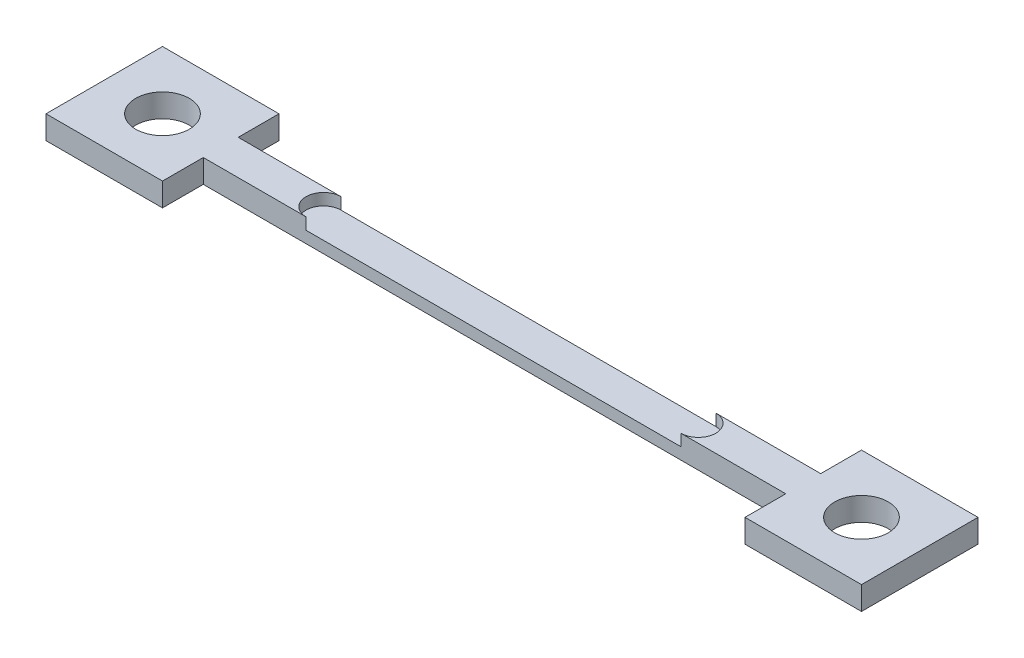
ISO-10303-21;
HEADER;
FILE_DESCRIPTION(('STEP AP214'),'2;1');
FILE_NAME('part.step','',(''),(''),'','','');
FILE_SCHEMA(('AUTOMOTIVE_DESIGN { 1 0 10303 214 1 1 1 1 }'));
ENDSEC;
DATA;
#1=APPLICATION_CONTEXT('core data for automotive mechanical design processes');
#2=APPLICATION_PROTOCOL_DEFINITION('international standard','automotive_design',2000,#1);
#3=PRODUCT_CONTEXT('',#1,'mechanical');
#4=PRODUCT('Part','Part','',(#3));
#5=PRODUCT_RELATED_PRODUCT_CATEGORY('part','',(#4));
#6=PRODUCT_DEFINITION_FORMATION('','',#4);
#7=PRODUCT_DEFINITION_CONTEXT('part definition',#1,'design');
#8=PRODUCT_DEFINITION('design','',#6,#7);
#9=PRODUCT_DEFINITION_SHAPE('','',#8);
#10=(LENGTH_UNIT() NAMED_UNIT(*) SI_UNIT(.MILLI.,.METRE.));
#11=(NAMED_UNIT(*) PLANE_ANGLE_UNIT() SI_UNIT($,.RADIAN.));
#12=(NAMED_UNIT(*) SI_UNIT($,.STERADIAN.) SOLID_ANGLE_UNIT());
#13=UNCERTAINTY_MEASURE_WITH_UNIT(LENGTH_MEASURE(1.E-05),#10,'distance_accuracy_value','');
#14=(GEOMETRIC_REPRESENTATION_CONTEXT(3) GLOBAL_UNCERTAINTY_ASSIGNED_CONTEXT((#13)) GLOBAL_UNIT_ASSIGNED_CONTEXT((#10,
#11,#12)) REPRESENTATION_CONTEXT('',''));
#15=CARTESIAN_POINT('',(0.,0.,0.));
#16=DIRECTION('',(0.,0.,1.));
#17=DIRECTION('',(1.,0.,0.));
#18=AXIS2_PLACEMENT_3D('',#15,#16,#17);
#19=CARTESIAN_POINT('',(-41.4240464845624,0.635,8.37825946530759));
#20=DIRECTION('',(0.,0.,1.));
#21=DIRECTION('',(1.,0.,0.));
#22=AXIS2_PLACEMENT_3D('',#19,#20,#21);
#23=PLANE('',#22);
#24=DIRECTION('',(0.,1.,0.));
#25=VECTOR('',#24,1.);
#26=CARTESIAN_POINT('',(-35.8219204168382,0.,8.37825946530759));
#27=LINE('',#26,#25);
#28=CARTESIAN_POINT('',(-35.8219204168382,0.,8.37825946530759));
#29=VERTEX_POINT('',#28);
#30=CARTESIAN_POINT('',(-35.8219204168382,0.635,8.37825946530759));
#31=VERTEX_POINT('',#30);
#32=EDGE_CURVE('E192',#29,#31,#27,.T.);
#33=ORIENTED_EDGE('',*,*,#32,.F.);
#34=DIRECTION('',(-1.,0.,0.));
#35=VECTOR('',#34,1.);
#36=CARTESIAN_POINT('',(0.,0.,8.37825946530759));
#37=LINE('',#36,#35);
#38=CARTESIAN_POINT('',(-15.3916667899654,0.,8.37825946530759));
#39=VERTEX_POINT('',#38);
#40=EDGE_CURVE('E252',#39,#29,#37,.T.);
#41=ORIENTED_EDGE('',*,*,#40,.F.);
#42=DIRECTION('',(0.,1.,0.));
#43=VECTOR('',#42,1.);
#44=CARTESIAN_POINT('',(-15.3916667899654,0.,8.37825946530759));
#45=LINE('',#44,#43);
#46=CARTESIAN_POINT('',(-15.3916667899654,0.635,8.37825946530759));
#47=VERTEX_POINT('',#46);
#48=EDGE_CURVE('E265',#39,#47,#45,.T.);
#49=ORIENTED_EDGE('',*,*,#48,.T.);
#50=DIRECTION('',(-1.,0.,0.));
#51=VECTOR('',#50,1.);
#52=CARTESIAN_POINT('',(-41.4240464845624,0.635,8.37825946530759));
#53=LINE('',#52,#51);
#54=CARTESIAN_POINT('',(-9.67404648456241,0.635,8.37825946530759));
#55=VERTEX_POINT('',#54);
#56=EDGE_CURVE('E373',#55,#47,#53,.T.);
#57=ORIENTED_EDGE('',*,*,#56,.F.);
#58=DIRECTION('',(0.,-1.,0.));
#59=VECTOR('',#58,1.);
#60=CARTESIAN_POINT('',(-9.67404648456241,0.635,8.37825946530759));
#61=LINE('',#60,#59);
#62=CARTESIAN_POINT('',(-9.67404648456241,-0.635,8.37825946530759));
#63=VERTEX_POINT('',#62);
#64=EDGE_CURVE('E48',#55,#63,#61,.T.);
#65=ORIENTED_EDGE('',*,*,#64,.T.);
#66=DIRECTION('',(-1.,0.,0.));
#67=VECTOR('',#66,1.);
#68=CARTESIAN_POINT('',(-41.4240464845624,-0.635,8.37825946530759));
#69=LINE('',#68,#67);
#70=CARTESIAN_POINT('',(-41.4240464845624,-0.635,8.37825946530759));
#71=VERTEX_POINT('',#70);
#72=EDGE_CURVE('E352',#63,#71,#69,.T.);
#73=ORIENTED_EDGE('',*,*,#72,.T.);
#74=DIRECTION('',(0.,-1.,0.));
#75=VECTOR('',#74,1.);
#76=CARTESIAN_POINT('',(-41.4240464845624,0.635,8.37825946530759));
#77=LINE('',#76,#75);
#78=CARTESIAN_POINT('',(-41.4240464845624,0.635,8.37825946530759));
#79=VERTEX_POINT('',#78);
#80=EDGE_CURVE('E361',#79,#71,#77,.T.);
#81=ORIENTED_EDGE('',*,*,#80,.F.);
#82=EDGE_CURVE('E415',#31,#79,#53,.T.);
#83=ORIENTED_EDGE('',*,*,#82,.F.);
#84=EDGE_LOOP('',(#33,#41,#49,#57,#65,#73,#81,#83));
#85=FACE_BOUND('',#84,.T.);
#86=ADVANCED_FACE('F39',(#85),#23,.F.);
#87=CARTESIAN_POINT('',(-3.32404648456241,0.635,6.15575946530759));
#88=DIRECTION('',(0.,1.,0.));
#89=DIRECTION('',(0.,0.,1.));
#90=AXIS2_PLACEMENT_3D('',#87,#88,#89);
#91=PLANE('',#90);
#92=CARTESIAN_POINT('',(-35.8219204168382,0.635,9.33075946530759));
#93=DIRECTION('',(0.,1.,0.));
#94=DIRECTION('',(0.,0.,1.));
#95=AXIS2_PLACEMENT_3D('',#92,#93,#94);
#96=CIRCLE('',#95,0.952500000000003);
#97=CARTESIAN_POINT('',(-35.8219204168382,0.635,10.2832594653076));
#98=VERTEX_POINT('',#97);
#99=EDGE_CURVE('E255',#31,#98,#96,.T.);
#100=ORIENTED_EDGE('',*,*,#99,.F.);
#101=ORIENTED_EDGE('',*,*,#82,.T.);
#102=DIRECTION('',(0.,0.,-1.));
#103=VECTOR('',#102,1.);
#104=CARTESIAN_POINT('',(-41.4240464845624,0.635,8.37825946530759));
#105=LINE('',#104,#103);
#106=CARTESIAN_POINT('',(-41.4240464845624,0.635,6.15575946530758));
#107=VERTEX_POINT('',#106);
#108=EDGE_CURVE('E412',#79,#107,#105,.T.);
#109=ORIENTED_EDGE('',*,*,#108,.T.);
#110=DIRECTION('',(-1.,0.,0.));
#111=VECTOR('',#110,1.);
#112=CARTESIAN_POINT('',(-47.7740464845624,0.635,6.15575946530758));
#113=LINE('',#112,#111);
#114=CARTESIAN_POINT('',(-47.7740464845624,0.635,6.15575946530758));
#115=VERTEX_POINT('',#114);
#116=EDGE_CURVE('E403',#107,#115,#113,.T.);
#117=ORIENTED_EDGE('',*,*,#116,.T.);
#118=DIRECTION('',(0.,0.,1.));
#119=VECTOR('',#118,1.);
#120=CARTESIAN_POINT('',(-47.7740464845624,0.635,12.5057594653076));
#121=LINE('',#120,#119);
#122=CARTESIAN_POINT('',(-47.7740464845624,0.635,12.5057594653076));
#123=VERTEX_POINT('',#122);
#124=EDGE_CURVE('E392',#115,#123,#121,.T.);
#125=ORIENTED_EDGE('',*,*,#124,.T.);
#126=DIRECTION('',(1.,0.,0.));
#127=VECTOR('',#126,1.);
#128=CARTESIAN_POINT('',(-47.7740464845624,0.635,12.5057594653076));
#129=LINE('',#128,#127);
#130=CARTESIAN_POINT('',(-41.4240464845624,0.635,12.5057594653076));
#131=VERTEX_POINT('',#130);
#132=EDGE_CURVE('E402',#123,#131,#129,.T.);
#133=ORIENTED_EDGE('',*,*,#132,.T.);
#134=DIRECTION('',(0.,0.,-1.));
#135=VECTOR('',#134,1.);
#136=CARTESIAN_POINT('',(-41.4240464845624,0.635,10.2832594653076));
#137=LINE('',#136,#135);
#138=CARTESIAN_POINT('',(-41.4240464845624,0.635,10.2832594653076));
#139=VERTEX_POINT('',#138);
#140=EDGE_CURVE('E334',#131,#139,#137,.T.);
#141=ORIENTED_EDGE('',*,*,#140,.T.);
#142=DIRECTION('',(1.,0.,0.));
#143=VECTOR('',#142,1.);
#144=CARTESIAN_POINT('',(-41.4240464845624,0.635,10.2832594653076));
#145=LINE('',#144,#143);
#146=EDGE_CURVE('E157',#139,#98,#145,.T.);
#147=ORIENTED_EDGE('',*,*,#146,.T.);
#148=EDGE_LOOP('',(#100,#101,#109,#117,#125,#133,#141,#147));
#149=FACE_BOUND('',#148,.T.);
#150=CARTESIAN_POINT('',(-44.5990464845624,0.635,9.33075946530758));
#151=DIRECTION('',(0.,1.,0.));
#152=DIRECTION('',(0.,0.,1.));
#153=AXIS2_PLACEMENT_3D('',#150,#151,#152);
#154=CIRCLE('',#153,1.4605);
#155=CARTESIAN_POINT('',(-44.5990464845624,0.635,10.7912594653076));
#156=VERTEX_POINT('',#155);
#157=EDGE_CURVE('E199',#156,#156,#154,.T.);
#158=ORIENTED_EDGE('',*,*,#157,.F.);
#159=EDGE_LOOP('',(#158));
#160=FACE_BOUND('',#159,.T.);
#161=ADVANCED_FACE('F331',(#149,#160),#91,.T.);
#162=CARTESIAN_POINT('',(-9.67404648456241,0.635,6.15575946530759));
#163=DIRECTION('',(0.,0.,1.));
#164=DIRECTION('',(1.,0.,0.));
#165=AXIS2_PLACEMENT_3D('',#162,#163,#164);
#166=PLANE('',#165);
#167=DIRECTION('',(-1.,0.,0.));
#168=VECTOR('',#167,1.);
#169=CARTESIAN_POINT('',(-9.67404648456241,-0.635,6.15575946530759));
#170=LINE('',#169,#168);
#171=CARTESIAN_POINT('',(-3.32404648456241,-0.635,6.15575946530759));
#172=VERTEX_POINT('',#171);
#173=CARTESIAN_POINT('',(-9.67404648456241,-0.635,6.15575946530759));
#174=VERTEX_POINT('',#173);
#175=EDGE_CURVE('E214',#172,#174,#170,.T.);
#176=ORIENTED_EDGE('',*,*,#175,.T.);
#177=DIRECTION('',(0.,-1.,0.));
#178=VECTOR('',#177,1.);
#179=CARTESIAN_POINT('',(-9.67404648456241,0.635,6.15575946530759));
#180=LINE('',#179,#178);
#181=CARTESIAN_POINT('',(-9.67404648456241,0.635,6.15575946530759));
#182=VERTEX_POINT('',#181);
#183=EDGE_CURVE('E12',#182,#174,#180,.T.);
#184=ORIENTED_EDGE('',*,*,#183,.F.);
#185=DIRECTION('',(-1.,0.,0.));
#186=VECTOR('',#185,1.);
#187=CARTESIAN_POINT('',(-9.67404648456241,0.635,6.15575946530759));
#188=LINE('',#187,#186);
#189=CARTESIAN_POINT('',(-3.32404648456241,0.635,6.15575946530759));
#190=VERTEX_POINT('',#189);
#191=EDGE_CURVE('E215',#190,#182,#188,.T.);
#192=ORIENTED_EDGE('',*,*,#191,.F.);
#193=DIRECTION('',(0.,-1.,0.));
#194=VECTOR('',#193,1.);
#195=CARTESIAN_POINT('',(-3.32404648456241,0.635,6.15575946530759));
#196=LINE('',#195,#194);
#197=EDGE_CURVE('E171',#190,#172,#196,.T.);
#198=ORIENTED_EDGE('',*,*,#197,.T.);
#199=EDGE_LOOP('',(#176,#184,#192,#198));
#200=FACE_BOUND('',#199,.T.);
#201=ADVANCED_FACE('F41',(#200),#166,.F.);
#202=CARTESIAN_POINT('',(-9.67404648456241,0.635,8.37825946530759));
#203=DIRECTION('',(1.,0.,0.));
#204=DIRECTION('',(0.,0.,-1.));
#205=AXIS2_PLACEMENT_3D('',#202,#203,#204);
#206=PLANE('',#205);
#207=DIRECTION('',(0.,0.,1.));
#208=VECTOR('',#207,1.);
#209=CARTESIAN_POINT('',(-9.67404648456241,-0.635,8.37825946530759));
#210=LINE('',#209,#208);
#211=EDGE_CURVE('E349',#174,#63,#210,.T.);
#212=ORIENTED_EDGE('',*,*,#211,.T.);
#213=ORIENTED_EDGE('',*,*,#64,.F.);
#214=DIRECTION('',(0.,0.,1.));
#215=VECTOR('',#214,1.);
#216=CARTESIAN_POINT('',(-9.67404648456241,0.635,8.37825946530759));
#217=LINE('',#216,#215);
#218=EDGE_CURVE('E117',#182,#55,#217,.T.);
#219=ORIENTED_EDGE('',*,*,#218,.F.);
#220=ORIENTED_EDGE('',*,*,#183,.T.);
#221=EDGE_LOOP('',(#212,#213,#219,#220));
#222=FACE_BOUND('',#221,.T.);
#223=ADVANCED_FACE('F421',(#222),#206,.F.);
#224=CARTESIAN_POINT('',(-41.4240464845624,0.635,8.37825946530759));
#225=DIRECTION('',(-1.,0.,0.));
#226=DIRECTION('',(0.,0.,1.));
#227=AXIS2_PLACEMENT_3D('',#224,#225,#226);
#228=PLANE('',#227);
#229=DIRECTION('',(0.,0.,-1.));
#230=VECTOR('',#229,1.);
#231=CARTESIAN_POINT('',(-41.4240464845624,-0.635,8.37825946530759));
#232=LINE('',#231,#230);
#233=CARTESIAN_POINT('',(-41.4240464845624,-0.635,6.15575946530758));
#234=VERTEX_POINT('',#233);
#235=EDGE_CURVE('E355',#71,#234,#232,.T.);
#236=ORIENTED_EDGE('',*,*,#235,.T.);
#237=DIRECTION('',(0.,-1.,0.));
#238=VECTOR('',#237,1.);
#239=CARTESIAN_POINT('',(-41.4240464845624,0.635,6.15575946530758));
#240=LINE('',#239,#238);
#241=EDGE_CURVE('E364',#107,#234,#240,.T.);
#242=ORIENTED_EDGE('',*,*,#241,.F.);
#243=ORIENTED_EDGE('',*,*,#108,.F.);
#244=ORIENTED_EDGE('',*,*,#80,.T.);
#245=EDGE_LOOP('',(#236,#242,#243,#244));
#246=FACE_BOUND('',#245,.T.);
#247=ADVANCED_FACE('F423',(#246),#228,.F.);
#248=CARTESIAN_POINT('',(-47.7740464845624,0.635,6.15575946530758));
#249=DIRECTION('',(0.,0.,1.));
#250=DIRECTION('',(1.,0.,0.));
#251=AXIS2_PLACEMENT_3D('',#248,#249,#250);
#252=PLANE('',#251);
#253=DIRECTION('',(-1.,0.,0.));
#254=VECTOR('',#253,1.);
#255=CARTESIAN_POINT('',(-47.7740464845624,-0.635,6.15575946530758));
#256=LINE('',#255,#254);
#257=CARTESIAN_POINT('',(-47.7740464845624,-0.635,6.15575946530758));
#258=VERTEX_POINT('',#257);
#259=EDGE_CURVE('E297',#234,#258,#256,.T.);
#260=ORIENTED_EDGE('',*,*,#259,.T.);
#261=DIRECTION('',(0.,-1.,0.));
#262=VECTOR('',#261,1.);
#263=CARTESIAN_POINT('',(-47.7740464845624,0.635,6.15575946530758));
#264=LINE('',#263,#262);
#265=EDGE_CURVE('E283',#115,#258,#264,.T.);
#266=ORIENTED_EDGE('',*,*,#265,.F.);
#267=ORIENTED_EDGE('',*,*,#116,.F.);
#268=ORIENTED_EDGE('',*,*,#241,.T.);
#269=EDGE_LOOP('',(#260,#266,#267,#268));
#270=FACE_BOUND('',#269,.T.);
#271=ADVANCED_FACE('F386',(#270),#252,.F.);
#272=CARTESIAN_POINT('',(-47.7740464845624,0.635,12.5057594653076));
#273=DIRECTION('',(1.,0.,0.));
#274=DIRECTION('',(0.,0.,-1.));
#275=AXIS2_PLACEMENT_3D('',#272,#273,#274);
#276=PLANE('',#275);
#277=DIRECTION('',(0.,0.,1.));
#278=VECTOR('',#277,1.);
#279=CARTESIAN_POINT('',(-47.7740464845624,-0.635,12.5057594653076));
#280=LINE('',#279,#278);
#281=CARTESIAN_POINT('',(-47.7740464845624,-0.635,12.5057594653076));
#282=VERTEX_POINT('',#281);
#283=EDGE_CURVE('E292',#258,#282,#280,.T.);
#284=ORIENTED_EDGE('',*,*,#283,.T.);
#285=DIRECTION('',(0.,-1.,0.));
#286=VECTOR('',#285,1.);
#287=CARTESIAN_POINT('',(-47.7740464845624,0.635,12.5057594653076));
#288=LINE('',#287,#286);
#289=EDGE_CURVE('E279',#123,#282,#288,.T.);
#290=ORIENTED_EDGE('',*,*,#289,.F.);
#291=ORIENTED_EDGE('',*,*,#124,.F.);
#292=ORIENTED_EDGE('',*,*,#265,.T.);
#293=EDGE_LOOP('',(#284,#290,#291,#292));
#294=FACE_BOUND('',#293,.T.);
#295=ADVANCED_FACE('F390',(#294),#276,.F.);
#296=CARTESIAN_POINT('',(-47.7740464845624,0.635,12.5057594653076));
#297=DIRECTION('',(0.,0.,-1.));
#298=DIRECTION('',(-1.,0.,0.));
#299=AXIS2_PLACEMENT_3D('',#296,#297,#298);
#300=PLANE('',#299);
#301=DIRECTION('',(1.,0.,0.));
#302=VECTOR('',#301,1.);
#303=CARTESIAN_POINT('',(-47.7740464845624,-0.635,12.5057594653076));
#304=LINE('',#303,#302);
#305=CARTESIAN_POINT('',(-41.4240464845624,-0.635,12.5057594653076));
#306=VERTEX_POINT('',#305);
#307=EDGE_CURVE('E296',#282,#306,#304,.T.);
#308=ORIENTED_EDGE('',*,*,#307,.T.);
#309=DIRECTION('',(0.,-1.,0.));
#310=VECTOR('',#309,1.);
#311=CARTESIAN_POINT('',(-41.4240464845624,0.635,12.5057594653076));
#312=LINE('',#311,#310);
#313=EDGE_CURVE('E275',#131,#306,#312,.T.);
#314=ORIENTED_EDGE('',*,*,#313,.F.);
#315=ORIENTED_EDGE('',*,*,#132,.F.);
#316=ORIENTED_EDGE('',*,*,#289,.T.);
#317=EDGE_LOOP('',(#308,#314,#315,#316));
#318=FACE_BOUND('',#317,.T.);
#319=ADVANCED_FACE('F398',(#318),#300,.F.);
#320=CARTESIAN_POINT('',(-41.4240464845624,0.635,10.2832594653076));
#321=DIRECTION('',(-1.,0.,0.));
#322=DIRECTION('',(0.,0.,1.));
#323=AXIS2_PLACEMENT_3D('',#320,#321,#322);
#324=PLANE('',#323);
#325=DIRECTION('',(0.,0.,-1.));
#326=VECTOR('',#325,1.);
#327=CARTESIAN_POINT('',(-41.4240464845624,-0.635,10.2832594653076));
#328=LINE('',#327,#326);
#329=CARTESIAN_POINT('',(-41.4240464845624,-0.635,10.2832594653076));
#330=VERTEX_POINT('',#329);
#331=EDGE_CURVE('E302',#306,#330,#328,.T.);
#332=ORIENTED_EDGE('',*,*,#331,.T.);
#333=DIRECTION('',(0.,-1.,0.));
#334=VECTOR('',#333,1.);
#335=CARTESIAN_POINT('',(-41.4240464845624,0.635,10.2832594653076));
#336=LINE('',#335,#334);
#337=EDGE_CURVE('E272',#139,#330,#336,.T.);
#338=ORIENTED_EDGE('',*,*,#337,.F.);
#339=ORIENTED_EDGE('',*,*,#140,.F.);
#340=ORIENTED_EDGE('',*,*,#313,.T.);
#341=EDGE_LOOP('',(#332,#338,#339,#340));
#342=FACE_BOUND('',#341,.T.);
#343=ADVANCED_FACE('F401',(#342),#324,.F.);
#344=CARTESIAN_POINT('',(-41.4240464845624,0.635,10.2832594653076));
#345=DIRECTION('',(0.,0.,-1.));
#346=DIRECTION('',(-1.,0.,0.));
#347=AXIS2_PLACEMENT_3D('',#344,#345,#346);
#348=PLANE('',#347);
#349=DIRECTION('',(1.,0.,0.));
#350=VECTOR('',#349,1.);
#351=CARTESIAN_POINT('',(0.,0.,10.2832594653076));
#352=LINE('',#351,#350);
#353=CARTESIAN_POINT('',(-35.8219204168382,0.,10.2832594653076));
#354=VERTEX_POINT('',#353);
#355=CARTESIAN_POINT('',(-15.3916667899654,0.,10.2832594653076));
#356=VERTEX_POINT('',#355);
#357=EDGE_CURVE('E244',#354,#356,#352,.T.);
#358=ORIENTED_EDGE('',*,*,#357,.F.);
#359=DIRECTION('',(0.,1.,0.));
#360=VECTOR('',#359,1.);
#361=CARTESIAN_POINT('',(-35.8219204168382,0.,10.2832594653076));
#362=LINE('',#361,#360);
#363=EDGE_CURVE('E193',#354,#98,#362,.T.);
#364=ORIENTED_EDGE('',*,*,#363,.T.);
#365=ORIENTED_EDGE('',*,*,#146,.F.);
#366=ORIENTED_EDGE('',*,*,#337,.T.);
#367=DIRECTION('',(1.,0.,0.));
#368=VECTOR('',#367,1.);
#369=CARTESIAN_POINT('',(-41.4240464845624,-0.635,10.2832594653076));
#370=LINE('',#369,#368);
#371=CARTESIAN_POINT('',(-9.67404648456241,-0.635,10.2832594653076));
#372=VERTEX_POINT('',#371);
#373=EDGE_CURVE('E483',#330,#372,#370,.T.);
#374=ORIENTED_EDGE('',*,*,#373,.T.);
#375=DIRECTION('',(0.,-1.,0.));
#376=VECTOR('',#375,1.);
#377=CARTESIAN_POINT('',(-9.67404648456241,0.635,10.2832594653076));
#378=LINE('',#377,#376);
#379=CARTESIAN_POINT('',(-9.67404648456241,0.635,10.2832594653076));
#380=VERTEX_POINT('',#379);
#381=EDGE_CURVE('E166',#380,#372,#378,.T.);
#382=ORIENTED_EDGE('',*,*,#381,.F.);
#383=CARTESIAN_POINT('',(-15.3916667899654,0.635,10.2832594653076));
#384=VERTEX_POINT('',#383);
#385=EDGE_CURVE('E153',#384,#380,#145,.T.);
#386=ORIENTED_EDGE('',*,*,#385,.F.);
#387=DIRECTION('',(0.,1.,0.));
#388=VECTOR('',#387,1.);
#389=CARTESIAN_POINT('',(-15.3916667899654,0.,10.2832594653076));
#390=LINE('',#389,#388);
#391=EDGE_CURVE('E55',#356,#384,#390,.T.);
#392=ORIENTED_EDGE('',*,*,#391,.F.);
#393=EDGE_LOOP('',(#358,#364,#365,#366,#374,#382,#386,#392));
#394=FACE_BOUND('',#393,.T.);
#395=ADVANCED_FACE('F330',(#394),#348,.F.);
#396=CARTESIAN_POINT('',(-9.67404648456241,0.635,10.2832594653076));
#397=DIRECTION('',(1.,0.,0.));
#398=DIRECTION('',(0.,0.,-1.));
#399=AXIS2_PLACEMENT_3D('',#396,#397,#398);
#400=PLANE('',#399);
#401=DIRECTION('',(0.,0.,1.));
#402=VECTOR('',#401,1.);
#403=CARTESIAN_POINT('',(-9.67404648456241,-0.635,10.2832594653076));
#404=LINE('',#403,#402);
#405=CARTESIAN_POINT('',(-9.67404648456241,-0.635,12.5057594653076));
#406=VERTEX_POINT('',#405);
#407=EDGE_CURVE('E163',#372,#406,#404,.T.);
#408=ORIENTED_EDGE('',*,*,#407,.T.);
#409=DIRECTION('',(0.,-1.,0.));
#410=VECTOR('',#409,1.);
#411=CARTESIAN_POINT('',(-9.67404648456241,0.635,12.5057594653076));
#412=LINE('',#411,#410);
#413=CARTESIAN_POINT('',(-9.67404648456241,0.635,12.5057594653076));
#414=VERTEX_POINT('',#413);
#415=EDGE_CURVE('E160',#414,#406,#412,.T.);
#416=ORIENTED_EDGE('',*,*,#415,.F.);
#417=DIRECTION('',(0.,0.,1.));
#418=VECTOR('',#417,1.);
#419=CARTESIAN_POINT('',(-9.67404648456241,0.635,10.2832594653076));
#420=LINE('',#419,#418);
#421=EDGE_CURVE('E145',#380,#414,#420,.T.);
#422=ORIENTED_EDGE('',*,*,#421,.F.);
#423=ORIENTED_EDGE('',*,*,#381,.T.);
#424=EDGE_LOOP('',(#408,#416,#422,#423));
#425=FACE_BOUND('',#424,.T.);
#426=ADVANCED_FACE('F161',(#425),#400,.F.);
#427=CARTESIAN_POINT('',(-9.67404648456241,0.635,12.5057594653076));
#428=DIRECTION('',(0.,0.,-1.));
#429=DIRECTION('',(-1.,0.,0.));
#430=AXIS2_PLACEMENT_3D('',#427,#428,#429);
#431=PLANE('',#430);
#432=DIRECTION('',(1.,0.,0.));
#433=VECTOR('',#432,1.);
#434=CARTESIAN_POINT('',(-9.67404648456241,-0.635,12.5057594653076));
#435=LINE('',#434,#433);
#436=CARTESIAN_POINT('',(-3.32404648456241,-0.635,12.5057594653076));
#437=VERTEX_POINT('',#436);
#438=EDGE_CURVE('E484',#406,#437,#435,.T.);
#439=ORIENTED_EDGE('',*,*,#438,.T.);
#440=DIRECTION('',(0.,-1.,0.));
#441=VECTOR('',#440,1.);
#442=CARTESIAN_POINT('',(-3.32404648456241,0.635,12.5057594653076));
#443=LINE('',#442,#441);
#444=CARTESIAN_POINT('',(-3.32404648456241,0.635,12.5057594653076));
#445=VERTEX_POINT('',#444);
#446=EDGE_CURVE('E167',#445,#437,#443,.T.);
#447=ORIENTED_EDGE('',*,*,#446,.F.);
#448=DIRECTION('',(1.,0.,0.));
#449=VECTOR('',#448,1.);
#450=CARTESIAN_POINT('',(-9.67404648456241,0.635,12.5057594653076));
#451=LINE('',#450,#449);
#452=EDGE_CURVE('E150',#414,#445,#451,.T.);
#453=ORIENTED_EDGE('',*,*,#452,.F.);
#454=ORIENTED_EDGE('',*,*,#415,.T.);
#455=EDGE_LOOP('',(#439,#447,#453,#454));
#456=FACE_BOUND('',#455,.T.);
#457=ADVANCED_FACE('F169',(#456),#431,.F.);
#458=CARTESIAN_POINT('',(-3.32404648456241,0.635,12.5057594653076));
#459=DIRECTION('',(-1.,0.,0.));
#460=DIRECTION('',(0.,0.,1.));
#461=AXIS2_PLACEMENT_3D('',#458,#459,#460);
#462=PLANE('',#461);
#463=DIRECTION('',(0.,0.,-1.));
#464=VECTOR('',#463,1.);
#465=CARTESIAN_POINT('',(-3.32404648456241,-0.635,12.5057594653076));
#466=LINE('',#465,#464);
#467=EDGE_CURVE('E109',#437,#172,#466,.T.);
#468=ORIENTED_EDGE('',*,*,#467,.T.);
#469=ORIENTED_EDGE('',*,*,#197,.F.);
#470=DIRECTION('',(0.,0.,-1.));
#471=VECTOR('',#470,1.);
#472=CARTESIAN_POINT('',(-3.32404648456241,0.635,12.5057594653076));
#473=LINE('',#472,#471);
#474=EDGE_CURVE('E64',#445,#190,#473,.T.);
#475=ORIENTED_EDGE('',*,*,#474,.F.);
#476=ORIENTED_EDGE('',*,*,#446,.T.);
#477=EDGE_LOOP('',(#468,#469,#475,#476));
#478=FACE_BOUND('',#477,.T.);
#479=ADVANCED_FACE('F450',(#478),#462,.F.);
#480=CARTESIAN_POINT('',(-15.3916667899654,0.635,9.33075946530759));
#481=DIRECTION('',(0.,1.,0.));
#482=DIRECTION('',(0.,0.,1.));
#483=AXIS2_PLACEMENT_3D('',#480,#481,#482);
#484=CIRCLE('',#483,0.9525);
#485=EDGE_CURVE('E245',#384,#47,#484,.T.);
#486=ORIENTED_EDGE('',*,*,#485,.F.);
#487=ORIENTED_EDGE('',*,*,#385,.T.);
#488=ORIENTED_EDGE('',*,*,#421,.T.);
#489=ORIENTED_EDGE('',*,*,#452,.T.);
#490=ORIENTED_EDGE('',*,*,#474,.T.);
#491=ORIENTED_EDGE('',*,*,#191,.T.);
#492=ORIENTED_EDGE('',*,*,#218,.T.);
#493=ORIENTED_EDGE('',*,*,#56,.T.);
#494=EDGE_LOOP('',(#486,#487,#488,#489,#490,#491,#492,#493));
#495=FACE_BOUND('',#494,.T.);
#496=CARTESIAN_POINT('',(-6.49904648456241,0.635,9.33075946530758));
#497=DIRECTION('',(0.,1.,0.));
#498=DIRECTION('',(0.,0.,1.));
#499=AXIS2_PLACEMENT_3D('',#496,#497,#498);
#500=CIRCLE('',#499,1.4605);
#501=CARTESIAN_POINT('',(-6.49904648456241,0.635,10.7912594653076));
#502=VERTEX_POINT('',#501);
#503=EDGE_CURVE('E186',#502,#502,#500,.T.);
#504=ORIENTED_EDGE('',*,*,#503,.F.);
#505=EDGE_LOOP('',(#504));
#506=FACE_BOUND('',#505,.T.);
#507=ADVANCED_FACE('F147',(#495,#506),#91,.T.);
#508=CARTESIAN_POINT('',(-3.32404648456241,-0.635,6.15575946530759));
#509=DIRECTION('',(0.,1.,0.));
#510=DIRECTION('',(0.,0.,1.));
#511=AXIS2_PLACEMENT_3D('',#508,#509,#510);
#512=PLANE('',#511);
#513=CARTESIAN_POINT('',(-6.49904648456241,-0.635,9.33075946530758));
#514=DIRECTION('',(0.,1.,0.));
#515=DIRECTION('',(0.,0.,1.));
#516=AXIS2_PLACEMENT_3D('',#513,#514,#515);
#517=CIRCLE('',#516,1.4605);
#518=CARTESIAN_POINT('',(-6.49904648456241,-0.635,10.7912594653076));
#519=VERTEX_POINT('',#518);
#520=EDGE_CURVE('E191',#519,#519,#517,.T.);
#521=ORIENTED_EDGE('',*,*,#520,.T.);
#522=EDGE_LOOP('',(#521));
#523=FACE_BOUND('',#522,.T.);
#524=CARTESIAN_POINT('',(-44.5990464845624,-0.635,9.33075946530758));
#525=DIRECTION('',(0.,1.,0.));
#526=DIRECTION('',(0.,0.,1.));
#527=AXIS2_PLACEMENT_3D('',#524,#525,#526);
#528=CIRCLE('',#527,1.4605);
#529=CARTESIAN_POINT('',(-44.5990464845624,-0.635,10.7912594653076));
#530=VERTEX_POINT('',#529);
#531=EDGE_CURVE('E210',#530,#530,#528,.T.);
#532=ORIENTED_EDGE('',*,*,#531,.T.);
#533=EDGE_LOOP('',(#532));
#534=FACE_BOUND('',#533,.T.);
#535=ORIENTED_EDGE('',*,*,#175,.F.);
#536=ORIENTED_EDGE('',*,*,#467,.F.);
#537=ORIENTED_EDGE('',*,*,#438,.F.);
#538=ORIENTED_EDGE('',*,*,#407,.F.);
#539=ORIENTED_EDGE('',*,*,#373,.F.);
#540=ORIENTED_EDGE('',*,*,#331,.F.);
#541=ORIENTED_EDGE('',*,*,#307,.F.);
#542=ORIENTED_EDGE('',*,*,#283,.F.);
#543=ORIENTED_EDGE('',*,*,#259,.F.);
#544=ORIENTED_EDGE('',*,*,#235,.F.);
#545=ORIENTED_EDGE('',*,*,#72,.F.);
#546=ORIENTED_EDGE('',*,*,#211,.F.);
#547=EDGE_LOOP('',(#535,#536,#537,#538,#539,#540,#541,#542,#543,#544,#545,#546));
#548=FACE_BOUND('',#547,.T.);
#549=ADVANCED_FACE('F377',(#523,#534,#548),#512,.F.);
#550=CARTESIAN_POINT('',(-44.5990464845624,0.635,9.33075946530758));
#551=DIRECTION('',(0.,1.,0.));
#552=DIRECTION('',(0.,0.,1.));
#553=AXIS2_PLACEMENT_3D('',#550,#551,#552);
#554=CYLINDRICAL_SURFACE('',#553,1.4605);
#555=ORIENTED_EDGE('',*,*,#531,.F.);
#556=EDGE_LOOP('',(#555));
#557=FACE_BOUND('',#556,.T.);
#558=ORIENTED_EDGE('',*,*,#157,.T.);
#559=EDGE_LOOP('',(#558));
#560=FACE_BOUND('',#559,.T.);
#561=ADVANCED_FACE('F454',(#557,#560),#554,.F.);
#562=CARTESIAN_POINT('',(-6.49904648456241,0.635,9.33075946530758));
#563=DIRECTION('',(0.,1.,0.));
#564=DIRECTION('',(0.,0.,1.));
#565=AXIS2_PLACEMENT_3D('',#562,#563,#564);
#566=CYLINDRICAL_SURFACE('',#565,1.4605);
#567=ORIENTED_EDGE('',*,*,#520,.F.);
#568=EDGE_LOOP('',(#567));
#569=FACE_BOUND('',#568,.T.);
#570=ORIENTED_EDGE('',*,*,#503,.T.);
#571=EDGE_LOOP('',(#570));
#572=FACE_BOUND('',#571,.T.);
#573=ADVANCED_FACE('F460',(#569,#572),#566,.F.);
#574=CARTESIAN_POINT('',(-35.8219204168382,0.,9.33075946530759));
#575=DIRECTION('',(0.,1.,0.));
#576=DIRECTION('',(0.,0.,1.));
#577=AXIS2_PLACEMENT_3D('',#574,#575,#576);
#578=CYLINDRICAL_SURFACE('',#577,0.952500000000003);
#579=ORIENTED_EDGE('',*,*,#99,.T.);
#580=ORIENTED_EDGE('',*,*,#363,.F.);
#581=CARTESIAN_POINT('',(-35.8219204168382,0.,9.33075946530759));
#582=DIRECTION('',(0.,1.,0.));
#583=DIRECTION('',(0.,0.,1.));
#584=AXIS2_PLACEMENT_3D('',#581,#582,#583);
#585=CIRCLE('',#584,0.952500000000003);
#586=EDGE_CURVE('E241',#29,#354,#585,.T.);
#587=ORIENTED_EDGE('',*,*,#586,.F.);
#588=ORIENTED_EDGE('',*,*,#32,.T.);
#589=EDGE_LOOP('',(#579,#580,#587,#588));
#590=FACE_BOUND('',#589,.T.);
#591=ADVANCED_FACE('F319',(#590),#578,.F.);
#592=CARTESIAN_POINT('',(-15.3916667899654,0.,9.33075946530759));
#593=DIRECTION('',(0.,1.,0.));
#594=DIRECTION('',(0.,0.,1.));
#595=AXIS2_PLACEMENT_3D('',#592,#593,#594);
#596=CYLINDRICAL_SURFACE('',#595,0.9525);
#597=ORIENTED_EDGE('',*,*,#485,.T.);
#598=ORIENTED_EDGE('',*,*,#48,.F.);
#599=CARTESIAN_POINT('',(-15.3916667899654,0.,9.33075946530759));
#600=DIRECTION('',(0.,1.,0.));
#601=DIRECTION('',(0.,0.,1.));
#602=AXIS2_PLACEMENT_3D('',#599,#600,#601);
#603=CIRCLE('',#602,0.9525);
#604=EDGE_CURVE('E248',#356,#39,#603,.T.);
#605=ORIENTED_EDGE('',*,*,#604,.F.);
#606=ORIENTED_EDGE('',*,*,#391,.T.);
#607=EDGE_LOOP('',(#597,#598,#605,#606));
#608=FACE_BOUND('',#607,.T.);
#609=ADVANCED_FACE('F467',(#608),#596,.F.);
#610=CARTESIAN_POINT('',(0.,0.,0.));
#611=DIRECTION('',(0.,1.,0.));
#612=DIRECTION('',(0.,0.,1.));
#613=AXIS2_PLACEMENT_3D('',#610,#611,#612);
#614=PLANE('',#613);
#615=ORIENTED_EDGE('',*,*,#586,.T.);
#616=ORIENTED_EDGE('',*,*,#357,.T.);
#617=ORIENTED_EDGE('',*,*,#604,.T.);
#618=ORIENTED_EDGE('',*,*,#40,.T.);
#619=EDGE_LOOP('',(#615,#616,#617,#618));
#620=FACE_BOUND('',#619,.T.);
#621=ADVANCED_FACE('F470',(#620),#614,.T.);
#622=CLOSED_SHELL('',(#86,#161,#201,#223,#247,#271,#295,#319,#343,#395,#426,#457,#479,#507,#549,
#561,#573,#591,#609,#621));
#623=MANIFOLD_SOLID_BREP('B2',#622);
#624=ADVANCED_BREP_SHAPE_REPRESENTATION('',(#18,#623),#14);
#625=SHAPE_DEFINITION_REPRESENTATION(#9,#624);
ENDSEC;
END-ISO-10303-21;
